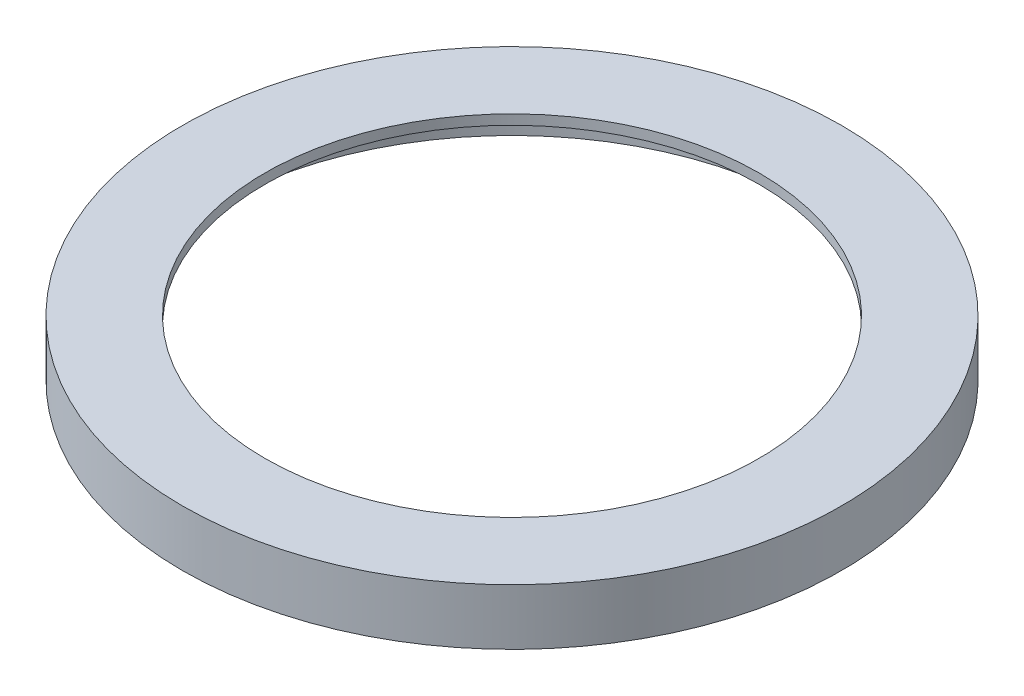
ISO-10303-21;
HEADER;
FILE_DESCRIPTION(('STEP AP214'),'2;1');
FILE_NAME('part.step','',(''),(''),'','','');
FILE_SCHEMA(('AUTOMOTIVE_DESIGN { 1 0 10303 214 1 1 1 1 }'));
ENDSEC;
DATA;
#1=APPLICATION_CONTEXT('core data for automotive mechanical design processes');
#2=APPLICATION_PROTOCOL_DEFINITION('international standard','automotive_design',2000,#1);
#3=PRODUCT_CONTEXT('',#1,'mechanical');
#4=PRODUCT('Part','Part','',(#3));
#5=PRODUCT_RELATED_PRODUCT_CATEGORY('part','',(#4));
#6=PRODUCT_DEFINITION_FORMATION('','',#4);
#7=PRODUCT_DEFINITION_CONTEXT('part definition',#1,'design');
#8=PRODUCT_DEFINITION('design','',#6,#7);
#9=PRODUCT_DEFINITION_SHAPE('','',#8);
#10=(LENGTH_UNIT() NAMED_UNIT(*) SI_UNIT(.MILLI.,.METRE.));
#11=(NAMED_UNIT(*) PLANE_ANGLE_UNIT() SI_UNIT($,.RADIAN.));
#12=(NAMED_UNIT(*) SI_UNIT($,.STERADIAN.) SOLID_ANGLE_UNIT());
#13=UNCERTAINTY_MEASURE_WITH_UNIT(LENGTH_MEASURE(1.E-05),#10,'distance_accuracy_value','');
#14=(GEOMETRIC_REPRESENTATION_CONTEXT(3) GLOBAL_UNCERTAINTY_ASSIGNED_CONTEXT((#13)) GLOBAL_UNIT_ASSIGNED_CONTEXT((#10,
#11,#12)) REPRESENTATION_CONTEXT('',''));
#15=CARTESIAN_POINT('',(0.,0.,0.));
#16=DIRECTION('',(0.,0.,1.));
#17=DIRECTION('',(1.,0.,0.));
#18=AXIS2_PLACEMENT_3D('',#15,#16,#17);
#19=CARTESIAN_POINT('',(0.,16.,3.10323443322699));
#20=DIRECTION('',(0.,-1.,0.));
#21=DIRECTION('',(0.,0.,-1.));
#22=AXIS2_PLACEMENT_3D('',#19,#20,#21);
#23=CYLINDRICAL_SURFACE('',#22,75.);
#24=CARTESIAN_POINT('',(0.,16.,3.10323443322699));
#25=DIRECTION('',(0.,1.,0.));
#26=DIRECTION('',(0.,0.,1.));
#27=AXIS2_PLACEMENT_3D('',#24,#25,#26);
#28=CIRCLE('',#27,75.);
#29=CARTESIAN_POINT('',(0.,16.,78.103234433227));
#30=VERTEX_POINT('',#29);
#31=EDGE_CURVE('E42',#30,#30,#28,.T.);
#32=ORIENTED_EDGE('',*,*,#31,.T.);
#33=EDGE_LOOP('',(#32));
#34=FACE_BOUND('',#33,.T.);
#35=CARTESIAN_POINT('',(0.,13.,3.10323443322699));
#36=DIRECTION('',(0.,-1.,0.));
#37=DIRECTION('',(0.,0.,-1.));
#38=AXIS2_PLACEMENT_3D('',#35,#36,#37);
#39=CIRCLE('',#38,75.);
#40=CARTESIAN_POINT('',(0.,13.,-71.896765566773));
#41=VERTEX_POINT('',#40);
#42=EDGE_CURVE('E33',#41,#41,#39,.T.);
#43=ORIENTED_EDGE('',*,*,#42,.T.);
#44=EDGE_LOOP('',(#43));
#45=FACE_BOUND('',#44,.T.);
#46=ADVANCED_FACE('F29',(#34,#45),#23,.F.);
#47=CARTESIAN_POINT('',(0.,16.,3.10323443322699));
#48=DIRECTION('',(0.,1.,0.));
#49=DIRECTION('',(0.,0.,1.));
#50=AXIS2_PLACEMENT_3D('',#47,#48,#49);
#51=PLANE('',#50);
#52=CARTESIAN_POINT('',(0.,16.,3.10323443322699));
#53=DIRECTION('',(0.,1.,0.));
#54=DIRECTION('',(0.,0.,1.));
#55=AXIS2_PLACEMENT_3D('',#52,#53,#54);
#56=CIRCLE('',#55,100.);
#57=CARTESIAN_POINT('',(0.,16.,103.103234433227));
#58=VERTEX_POINT('',#57);
#59=EDGE_CURVE('E10',#58,#58,#56,.T.);
#60=ORIENTED_EDGE('',*,*,#59,.T.);
#61=EDGE_LOOP('',(#60));
#62=FACE_BOUND('',#61,.T.);
#63=ORIENTED_EDGE('',*,*,#31,.F.);
#64=EDGE_LOOP('',(#63));
#65=FACE_BOUND('',#64,.T.);
#66=ADVANCED_FACE('F67',(#62,#65),#51,.T.);
#67=CARTESIAN_POINT('',(0.,-1.,3.10323443322699));
#68=DIRECTION('',(0.,1.,0.));
#69=DIRECTION('',(0.,0.,1.));
#70=AXIS2_PLACEMENT_3D('',#67,#68,#69);
#71=PLANE('',#70);
#72=CARTESIAN_POINT('',(0.,-1.,3.10323443322705));
#73=DIRECTION('',(0.,-1.,0.));
#74=DIRECTION('',(0.,0.,-1.));
#75=AXIS2_PLACEMENT_3D('',#72,#73,#74);
#76=CIRCLE('',#75,91.);
#77=CARTESIAN_POINT('',(0.,-1.,-87.896765566773));
#78=VERTEX_POINT('',#77);
#79=EDGE_CURVE('E46',#78,#78,#76,.T.);
#80=ORIENTED_EDGE('',*,*,#79,.F.);
#81=EDGE_LOOP('',(#80));
#82=FACE_BOUND('',#81,.T.);
#83=CARTESIAN_POINT('',(0.,-1.,3.10323443322699));
#84=DIRECTION('',(0.,1.,0.));
#85=DIRECTION('',(0.,0.,1.));
#86=AXIS2_PLACEMENT_3D('',#83,#84,#85);
#87=CIRCLE('',#86,100.);
#88=CARTESIAN_POINT('',(0.,-1.,103.103234433227));
#89=VERTEX_POINT('',#88);
#90=EDGE_CURVE('E37',#89,#89,#87,.T.);
#91=ORIENTED_EDGE('',*,*,#90,.F.);
#92=EDGE_LOOP('',(#91));
#93=FACE_BOUND('',#92,.T.);
#94=ADVANCED_FACE('F73',(#82,#93),#71,.F.);
#95=CARTESIAN_POINT('',(0.,16.,3.10323443322699));
#96=DIRECTION('',(0.,-1.,0.));
#97=DIRECTION('',(0.,0.,-1.));
#98=AXIS2_PLACEMENT_3D('',#95,#96,#97);
#99=CYLINDRICAL_SURFACE('',#98,100.);
#100=ORIENTED_EDGE('',*,*,#59,.F.);
#101=EDGE_LOOP('',(#100));
#102=FACE_BOUND('',#101,.T.);
#103=ORIENTED_EDGE('',*,*,#90,.T.);
#104=EDGE_LOOP('',(#103));
#105=FACE_BOUND('',#104,.T.);
#106=ADVANCED_FACE('F31',(#102,#105),#99,.T.);
#107=CARTESIAN_POINT('',(0.,13.,3.10323443322705));
#108=DIRECTION('',(0.,-1.,0.));
#109=DIRECTION('',(0.,0.,-1.));
#110=AXIS2_PLACEMENT_3D('',#107,#108,#109);
#111=CYLINDRICAL_SURFACE('',#110,91.);
#112=CARTESIAN_POINT('',(0.,13.,3.10323443322705));
#113=DIRECTION('',(0.,-1.,0.));
#114=DIRECTION('',(0.,0.,-1.));
#115=AXIS2_PLACEMENT_3D('',#112,#113,#114);
#116=CIRCLE('',#115,91.);
#117=CARTESIAN_POINT('',(0.,13.,-87.896765566773));
#118=VERTEX_POINT('',#117);
#119=EDGE_CURVE('E49',#118,#118,#116,.T.);
#120=ORIENTED_EDGE('',*,*,#119,.F.);
#121=EDGE_LOOP('',(#120));
#122=FACE_BOUND('',#121,.T.);
#123=ORIENTED_EDGE('',*,*,#79,.T.);
#124=EDGE_LOOP('',(#123));
#125=FACE_BOUND('',#124,.T.);
#126=ADVANCED_FACE('F59',(#122,#125),#111,.F.);
#127=CARTESIAN_POINT('',(0.,13.,3.10323443322705));
#128=DIRECTION('',(0.,-1.,0.));
#129=DIRECTION('',(0.,0.,-1.));
#130=AXIS2_PLACEMENT_3D('',#127,#128,#129);
#131=PLANE('',#130);
#132=ORIENTED_EDGE('',*,*,#42,.F.);
#133=EDGE_LOOP('',(#132));
#134=FACE_BOUND('',#133,.T.);
#135=ORIENTED_EDGE('',*,*,#119,.T.);
#136=EDGE_LOOP('',(#135));
#137=FACE_BOUND('',#136,.T.);
#138=ADVANCED_FACE('F57',(#134,#137),#131,.T.);
#139=CLOSED_SHELL('',(#46,#66,#94,#106,#126,#138));
#140=MANIFOLD_SOLID_BREP('B2',#139);
#141=ADVANCED_BREP_SHAPE_REPRESENTATION('',(#18,#140),#14);
#142=SHAPE_DEFINITION_REPRESENTATION(#9,#141);
ENDSEC;
END-ISO-10303-21;
